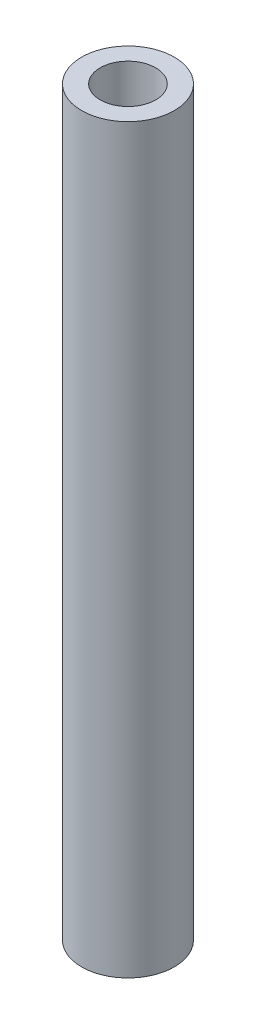
ISO-10303-21;
HEADER;
FILE_DESCRIPTION(('STEP AP214'),'2;1');
FILE_NAME('part.step','',(''),(''),'','','');
FILE_SCHEMA(('AUTOMOTIVE_DESIGN { 1 0 10303 214 1 1 1 1 }'));
ENDSEC;
DATA;
#1=APPLICATION_CONTEXT('core data for automotive mechanical design processes');
#2=APPLICATION_PROTOCOL_DEFINITION('international standard','automotive_design',2000,#1);
#3=PRODUCT_CONTEXT('',#1,'mechanical');
#4=PRODUCT('Part','Part','',(#3));
#5=PRODUCT_RELATED_PRODUCT_CATEGORY('part','',(#4));
#6=PRODUCT_DEFINITION_FORMATION('','',#4);
#7=PRODUCT_DEFINITION_CONTEXT('part definition',#1,'design');
#8=PRODUCT_DEFINITION('design','',#6,#7);
#9=PRODUCT_DEFINITION_SHAPE('','',#8);
#10=(LENGTH_UNIT() NAMED_UNIT(*) SI_UNIT(.MILLI.,.METRE.));
#11=(NAMED_UNIT(*) PLANE_ANGLE_UNIT() SI_UNIT($,.RADIAN.));
#12=(NAMED_UNIT(*) SI_UNIT($,.STERADIAN.) SOLID_ANGLE_UNIT());
#13=UNCERTAINTY_MEASURE_WITH_UNIT(LENGTH_MEASURE(1.E-05),#10,'distance_accuracy_value','');
#14=(GEOMETRIC_REPRESENTATION_CONTEXT(3) GLOBAL_UNCERTAINTY_ASSIGNED_CONTEXT((#13)) GLOBAL_UNIT_ASSIGNED_CONTEXT((#10,
#11,#12)) REPRESENTATION_CONTEXT('',''));
#15=CARTESIAN_POINT('',(0.,0.,0.));
#16=DIRECTION('',(0.,0.,1.));
#17=DIRECTION('',(1.,0.,0.));
#18=AXIS2_PLACEMENT_3D('',#15,#16,#17);
#19=CARTESIAN_POINT('',(0.,40.,0.));
#20=DIRECTION('',(0.,1.,0.));
#21=DIRECTION('',(0.,0.,1.));
#22=AXIS2_PLACEMENT_3D('',#19,#20,#21);
#23=PLANE('',#22);
#24=CARTESIAN_POINT('',(0.,40.,0.));
#25=DIRECTION('',(0.,1.,0.));
#26=DIRECTION('',(0.,0.,1.));
#27=AXIS2_PLACEMENT_3D('',#24,#25,#26);
#28=CIRCLE('',#27,2.5);
#29=CARTESIAN_POINT('',(0.,40.,2.5));
#30=VERTEX_POINT('',#29);
#31=EDGE_CURVE('E10',#30,#30,#28,.T.);
#32=ORIENTED_EDGE('',*,*,#31,.T.);
#33=EDGE_LOOP('',(#32));
#34=FACE_BOUND('',#33,.T.);
#35=CARTESIAN_POINT('',(0.,40.,0.));
#36=DIRECTION('',(0.,1.,0.));
#37=DIRECTION('',(0.,0.,1.));
#38=AXIS2_PLACEMENT_3D('',#35,#36,#37);
#39=CIRCLE('',#38,1.5);
#40=CARTESIAN_POINT('',(0.,40.,1.5));
#41=VERTEX_POINT('',#40);
#42=EDGE_CURVE('E54',#41,#41,#39,.T.);
#43=ORIENTED_EDGE('',*,*,#42,.F.);
#44=EDGE_LOOP('',(#43));
#45=FACE_BOUND('',#44,.T.);
#46=ADVANCED_FACE('F43',(#34,#45),#23,.T.);
#47=CARTESIAN_POINT('',(0.,0.,0.));
#48=DIRECTION('',(0.,1.,0.));
#49=DIRECTION('',(0.,0.,1.));
#50=AXIS2_PLACEMENT_3D('',#47,#48,#49);
#51=PLANE('',#50);
#52=CARTESIAN_POINT('',(0.,0.,0.));
#53=DIRECTION('',(0.,1.,0.));
#54=DIRECTION('',(0.,0.,1.));
#55=AXIS2_PLACEMENT_3D('',#52,#53,#54);
#56=CIRCLE('',#55,2.5);
#57=CARTESIAN_POINT('',(0.,0.,2.5));
#58=VERTEX_POINT('',#57);
#59=EDGE_CURVE('E47',#58,#58,#56,.T.);
#60=ORIENTED_EDGE('',*,*,#59,.F.);
#61=EDGE_LOOP('',(#60));
#62=FACE_BOUND('',#61,.T.);
#63=CARTESIAN_POINT('',(0.,0.,0.));
#64=DIRECTION('',(0.,1.,0.));
#65=DIRECTION('',(0.,0.,1.));
#66=AXIS2_PLACEMENT_3D('',#63,#64,#65);
#67=CIRCLE('',#66,1.5);
#68=CARTESIAN_POINT('',(0.,0.,1.5));
#69=VERTEX_POINT('',#68);
#70=EDGE_CURVE('E56',#69,#69,#67,.T.);
#71=ORIENTED_EDGE('',*,*,#70,.T.);
#72=EDGE_LOOP('',(#71));
#73=FACE_BOUND('',#72,.T.);
#74=ADVANCED_FACE('F66',(#62,#73),#51,.F.);
#75=CARTESIAN_POINT('',(0.,40.,0.));
#76=DIRECTION('',(0.,-1.,0.));
#77=DIRECTION('',(0.,0.,-1.));
#78=AXIS2_PLACEMENT_3D('',#75,#76,#77);
#79=CYLINDRICAL_SURFACE('',#78,2.5);
#80=ORIENTED_EDGE('',*,*,#31,.F.);
#81=EDGE_LOOP('',(#80));
#82=FACE_BOUND('',#81,.T.);
#83=ORIENTED_EDGE('',*,*,#59,.T.);
#84=EDGE_LOOP('',(#83));
#85=FACE_BOUND('',#84,.T.);
#86=ADVANCED_FACE('F45',(#82,#85),#79,.T.);
#87=CARTESIAN_POINT('',(0.,40.,0.));
#88=DIRECTION('',(0.,-1.,0.));
#89=DIRECTION('',(0.,0.,-1.));
#90=AXIS2_PLACEMENT_3D('',#87,#88,#89);
#91=CYLINDRICAL_SURFACE('',#90,1.5);
#92=ORIENTED_EDGE('',*,*,#42,.T.);
#93=EDGE_LOOP('',(#92));
#94=FACE_BOUND('',#93,.T.);
#95=ORIENTED_EDGE('',*,*,#70,.F.);
#96=EDGE_LOOP('',(#95));
#97=FACE_BOUND('',#96,.T.);
#98=ADVANCED_FACE('F62',(#94,#97),#91,.F.);
#99=CLOSED_SHELL('',(#46,#74,#86,#98));
#100=MANIFOLD_SOLID_BREP('B2',#99);
#101=ADVANCED_BREP_SHAPE_REPRESENTATION('',(#18,#100),#14);
#102=SHAPE_DEFINITION_REPRESENTATION(#9,#101);
ENDSEC;
END-ISO-10303-21;
